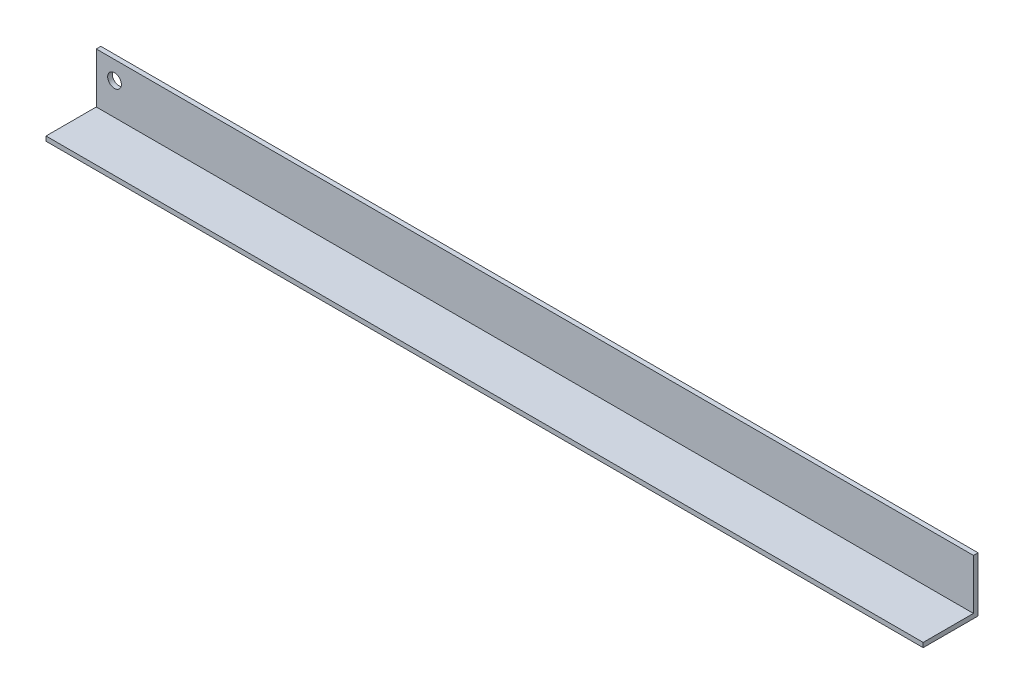
ISO-10303-21;
HEADER;
FILE_DESCRIPTION(('STEP AP214'),'2;1');
FILE_NAME('part.step','',(''),(''),'','','');
FILE_SCHEMA(('AUTOMOTIVE_DESIGN { 1 0 10303 214 1 1 1 1 }'));
ENDSEC;
DATA;
#1=APPLICATION_CONTEXT('core data for automotive mechanical design processes');
#2=APPLICATION_PROTOCOL_DEFINITION('international standard','automotive_design',2000,#1);
#3=PRODUCT_CONTEXT('',#1,'mechanical');
#4=PRODUCT('Part','Part','',(#3));
#5=PRODUCT_RELATED_PRODUCT_CATEGORY('part','',(#4));
#6=PRODUCT_DEFINITION_FORMATION('','',#4);
#7=PRODUCT_DEFINITION_CONTEXT('part definition',#1,'design');
#8=PRODUCT_DEFINITION('design','',#6,#7);
#9=PRODUCT_DEFINITION_SHAPE('','',#8);
#10=(LENGTH_UNIT() NAMED_UNIT(*) SI_UNIT(.MILLI.,.METRE.));
#11=(NAMED_UNIT(*) PLANE_ANGLE_UNIT() SI_UNIT($,.RADIAN.));
#12=(NAMED_UNIT(*) SI_UNIT($,.STERADIAN.) SOLID_ANGLE_UNIT());
#13=UNCERTAINTY_MEASURE_WITH_UNIT(LENGTH_MEASURE(1.E-05),#10,'distance_accuracy_value','');
#14=(GEOMETRIC_REPRESENTATION_CONTEXT(3) GLOBAL_UNCERTAINTY_ASSIGNED_CONTEXT((#13)) GLOBAL_UNIT_ASSIGNED_CONTEXT((#10,
#11,#12)) REPRESENTATION_CONTEXT('',''));
#15=CARTESIAN_POINT('',(0.,0.,0.));
#16=DIRECTION('',(0.,0.,1.));
#17=DIRECTION('',(1.,0.,0.));
#18=AXIS2_PLACEMENT_3D('',#15,#16,#17);
#19=CARTESIAN_POINT('',(304.8,0.,0.));
#20=DIRECTION('',(0.,0.,1.));
#21=DIRECTION('',(1.,0.,0.));
#22=AXIS2_PLACEMENT_3D('',#19,#20,#21);
#23=PLANE('',#22);
#24=CARTESIAN_POINT('',(-292.1,25.4,0.));
#25=DIRECTION('',(0.,0.,-1.));
#26=DIRECTION('',(-1.,0.,0.));
#27=AXIS2_PLACEMENT_3D('',#24,#25,#26);
#28=CIRCLE('',#27,4.76250000000001);
#29=CARTESIAN_POINT('',(-296.8625,25.4,0.));
#30=VERTEX_POINT('',#29);
#31=EDGE_CURVE('E120',#30,#30,#28,.T.);
#32=ORIENTED_EDGE('',*,*,#31,.F.);
#33=EDGE_LOOP('',(#32));
#34=FACE_BOUND('',#33,.T.);
#35=DIRECTION('',(0.,1.,0.));
#36=VECTOR('',#35,1.);
#37=CARTESIAN_POINT('',(-304.8,0.,0.));
#38=LINE('',#37,#36);
#39=CARTESIAN_POINT('',(-304.8,0.,0.));
#40=VERTEX_POINT('',#39);
#41=CARTESIAN_POINT('',(-304.8,38.1,0.));
#42=VERTEX_POINT('',#41);
#43=EDGE_CURVE('E116',#40,#42,#38,.T.);
#44=ORIENTED_EDGE('',*,*,#43,.T.);
#45=DIRECTION('',(-1.,0.,0.));
#46=VECTOR('',#45,1.);
#47=CARTESIAN_POINT('',(304.8,38.1,0.));
#48=LINE('',#47,#46);
#49=CARTESIAN_POINT('',(304.8,38.1,0.));
#50=VERTEX_POINT('',#49);
#51=EDGE_CURVE('E11',#50,#42,#48,.T.);
#52=ORIENTED_EDGE('',*,*,#51,.F.);
#53=DIRECTION('',(0.,1.,0.));
#54=VECTOR('',#53,1.);
#55=CARTESIAN_POINT('',(304.8,0.,0.));
#56=LINE('',#55,#54);
#57=CARTESIAN_POINT('',(304.8,0.,0.));
#58=VERTEX_POINT('',#57);
#59=EDGE_CURVE('E81',#58,#50,#56,.T.);
#60=ORIENTED_EDGE('',*,*,#59,.F.);
#61=DIRECTION('',(-1.,0.,0.));
#62=VECTOR('',#61,1.);
#63=CARTESIAN_POINT('',(304.8,0.,0.));
#64=LINE('',#63,#62);
#65=EDGE_CURVE('E112',#58,#40,#64,.T.);
#66=ORIENTED_EDGE('',*,*,#65,.T.);
#67=EDGE_LOOP('',(#44,#52,#60,#66));
#68=FACE_BOUND('',#67,.T.);
#69=ADVANCED_FACE('F35',(#34,#68),#23,.F.);
#70=CARTESIAN_POINT('',(304.8,38.1,3.175));
#71=DIRECTION('',(0.,1.,0.));
#72=DIRECTION('',(0.,0.,1.));
#73=AXIS2_PLACEMENT_3D('',#70,#71,#72);
#74=PLANE('',#73);
#75=DIRECTION('',(0.,0.,-1.));
#76=VECTOR('',#75,1.);
#77=CARTESIAN_POINT('',(-304.8,38.1,3.175));
#78=LINE('',#77,#76);
#79=CARTESIAN_POINT('',(-304.8,38.1,3.175));
#80=VERTEX_POINT('',#79);
#81=EDGE_CURVE('E119',#80,#42,#78,.T.);
#82=ORIENTED_EDGE('',*,*,#81,.F.);
#83=DIRECTION('',(-1.,0.,0.));
#84=VECTOR('',#83,1.);
#85=CARTESIAN_POINT('',(304.8,38.1,3.175));
#86=LINE('',#85,#84);
#87=CARTESIAN_POINT('',(304.8,38.1,3.175));
#88=VERTEX_POINT('',#87);
#89=EDGE_CURVE('E43',#88,#80,#86,.T.);
#90=ORIENTED_EDGE('',*,*,#89,.F.);
#91=DIRECTION('',(0.,0.,-1.));
#92=VECTOR('',#91,1.);
#93=CARTESIAN_POINT('',(304.8,38.1,3.175));
#94=LINE('',#93,#92);
#95=EDGE_CURVE('E167',#88,#50,#94,.T.);
#96=ORIENTED_EDGE('',*,*,#95,.T.);
#97=ORIENTED_EDGE('',*,*,#51,.T.);
#98=EDGE_LOOP('',(#82,#90,#96,#97));
#99=FACE_BOUND('',#98,.T.);
#100=ADVANCED_FACE('F138',(#99),#74,.T.);
#101=CARTESIAN_POINT('',(304.8,0.,3.175));
#102=DIRECTION('',(0.,0.,1.));
#103=DIRECTION('',(1.,0.,0.));
#104=AXIS2_PLACEMENT_3D('',#101,#102,#103);
#105=PLANE('',#104);
#106=CARTESIAN_POINT('',(-292.1,25.4,3.175));
#107=DIRECTION('',(0.,0.,1.));
#108=DIRECTION('',(1.,0.,0.));
#109=AXIS2_PLACEMENT_3D('',#106,#107,#108);
#110=CIRCLE('',#109,4.76250000000001);
#111=CARTESIAN_POINT('',(-287.3375,25.4,3.175));
#112=VERTEX_POINT('',#111);
#113=EDGE_CURVE('E161',#112,#112,#110,.F.);
#114=ORIENTED_EDGE('',*,*,#113,.T.);
#115=EDGE_LOOP('',(#114));
#116=FACE_BOUND('',#115,.T.);
#117=DIRECTION('',(0.,1.,0.));
#118=VECTOR('',#117,1.);
#119=CARTESIAN_POINT('',(-304.8,0.,3.175));
#120=LINE('',#119,#118);
#121=CARTESIAN_POINT('',(-304.8,3.175,3.175));
#122=VERTEX_POINT('',#121);
#123=EDGE_CURVE('E123',#122,#80,#120,.T.);
#124=ORIENTED_EDGE('',*,*,#123,.F.);
#125=DIRECTION('',(-1.,0.,0.));
#126=VECTOR('',#125,1.);
#127=CARTESIAN_POINT('',(304.8,3.175,3.175));
#128=LINE('',#127,#126);
#129=CARTESIAN_POINT('',(304.8,3.175,3.175));
#130=VERTEX_POINT('',#129);
#131=EDGE_CURVE('E102',#130,#122,#128,.T.);
#132=ORIENTED_EDGE('',*,*,#131,.F.);
#133=DIRECTION('',(0.,1.,0.));
#134=VECTOR('',#133,1.);
#135=CARTESIAN_POINT('',(304.8,0.,3.175));
#136=LINE('',#135,#134);
#137=EDGE_CURVE('E108',#130,#88,#136,.T.);
#138=ORIENTED_EDGE('',*,*,#137,.T.);
#139=ORIENTED_EDGE('',*,*,#89,.T.);
#140=EDGE_LOOP('',(#124,#132,#138,#139));
#141=FACE_BOUND('',#140,.T.);
#142=ADVANCED_FACE('F135',(#116,#141),#105,.T.);
#143=CARTESIAN_POINT('',(304.8,3.175,38.1));
#144=DIRECTION('',(0.,1.,0.));
#145=DIRECTION('',(0.,0.,1.));
#146=AXIS2_PLACEMENT_3D('',#143,#144,#145);
#147=PLANE('',#146);
#148=DIRECTION('',(0.,0.,-1.));
#149=VECTOR('',#148,1.);
#150=CARTESIAN_POINT('',(-304.8,3.175,38.1));
#151=LINE('',#150,#149);
#152=CARTESIAN_POINT('',(-304.8,3.175,38.1));
#153=VERTEX_POINT('',#152);
#154=EDGE_CURVE('E97',#153,#122,#151,.T.);
#155=ORIENTED_EDGE('',*,*,#154,.F.);
#156=DIRECTION('',(-1.,0.,0.));
#157=VECTOR('',#156,1.);
#158=CARTESIAN_POINT('',(304.8,3.175,38.1));
#159=LINE('',#158,#157);
#160=CARTESIAN_POINT('',(304.8,3.175,38.1));
#161=VERTEX_POINT('',#160);
#162=EDGE_CURVE('E92',#161,#153,#159,.T.);
#163=ORIENTED_EDGE('',*,*,#162,.F.);
#164=DIRECTION('',(0.,0.,-1.));
#165=VECTOR('',#164,1.);
#166=CARTESIAN_POINT('',(304.8,3.175,38.1));
#167=LINE('',#166,#165);
#168=EDGE_CURVE('E95',#161,#130,#167,.T.);
#169=ORIENTED_EDGE('',*,*,#168,.T.);
#170=ORIENTED_EDGE('',*,*,#131,.T.);
#171=EDGE_LOOP('',(#155,#163,#169,#170));
#172=FACE_BOUND('',#171,.T.);
#173=ADVANCED_FACE('F94',(#172),#147,.T.);
#174=CARTESIAN_POINT('',(304.8,0.,38.1));
#175=DIRECTION('',(0.,0.,1.));
#176=DIRECTION('',(1.,0.,0.));
#177=AXIS2_PLACEMENT_3D('',#174,#175,#176);
#178=PLANE('',#177);
#179=DIRECTION('',(0.,1.,0.));
#180=VECTOR('',#179,1.);
#181=CARTESIAN_POINT('',(-304.8,0.,38.1));
#182=LINE('',#181,#180);
#183=CARTESIAN_POINT('',(-304.8,0.,38.1));
#184=VERTEX_POINT('',#183);
#185=EDGE_CURVE('E127',#184,#153,#182,.T.);
#186=ORIENTED_EDGE('',*,*,#185,.F.);
#187=DIRECTION('',(-1.,0.,0.));
#188=VECTOR('',#187,1.);
#189=CARTESIAN_POINT('',(304.8,0.,38.1));
#190=LINE('',#189,#188);
#191=CARTESIAN_POINT('',(304.8,0.,38.1));
#192=VERTEX_POINT('',#191);
#193=EDGE_CURVE('E72',#192,#184,#190,.T.);
#194=ORIENTED_EDGE('',*,*,#193,.F.);
#195=DIRECTION('',(0.,1.,0.));
#196=VECTOR('',#195,1.);
#197=CARTESIAN_POINT('',(304.8,0.,38.1));
#198=LINE('',#197,#196);
#199=EDGE_CURVE('E106',#192,#161,#198,.T.);
#200=ORIENTED_EDGE('',*,*,#199,.T.);
#201=ORIENTED_EDGE('',*,*,#162,.T.);
#202=EDGE_LOOP('',(#186,#194,#200,#201));
#203=FACE_BOUND('',#202,.T.);
#204=ADVANCED_FACE('F110',(#203),#178,.T.);
#205=CARTESIAN_POINT('',(304.8,0.,38.1));
#206=DIRECTION('',(0.,1.,0.));
#207=DIRECTION('',(0.,0.,1.));
#208=AXIS2_PLACEMENT_3D('',#205,#206,#207);
#209=PLANE('',#208);
#210=DIRECTION('',(0.,0.,-1.));
#211=VECTOR('',#210,1.);
#212=CARTESIAN_POINT('',(-304.8,0.,38.1));
#213=LINE('',#212,#211);
#214=EDGE_CURVE('E75',#184,#40,#213,.T.);
#215=ORIENTED_EDGE('',*,*,#214,.T.);
#216=ORIENTED_EDGE('',*,*,#65,.F.);
#217=DIRECTION('',(0.,0.,-1.));
#218=VECTOR('',#217,1.);
#219=CARTESIAN_POINT('',(304.8,0.,38.1));
#220=LINE('',#219,#218);
#221=EDGE_CURVE('E51',#192,#58,#220,.T.);
#222=ORIENTED_EDGE('',*,*,#221,.F.);
#223=ORIENTED_EDGE('',*,*,#193,.T.);
#224=EDGE_LOOP('',(#215,#216,#222,#223));
#225=FACE_BOUND('',#224,.T.);
#226=ADVANCED_FACE('F143',(#225),#209,.F.);
#227=CARTESIAN_POINT('',(304.8,0.,0.));
#228=DIRECTION('',(-1.,0.,0.));
#229=DIRECTION('',(0.,0.,1.));
#230=AXIS2_PLACEMENT_3D('',#227,#228,#229);
#231=PLANE('',#230);
#232=ORIENTED_EDGE('',*,*,#59,.T.);
#233=ORIENTED_EDGE('',*,*,#95,.F.);
#234=ORIENTED_EDGE('',*,*,#137,.F.);
#235=ORIENTED_EDGE('',*,*,#168,.F.);
#236=ORIENTED_EDGE('',*,*,#199,.F.);
#237=ORIENTED_EDGE('',*,*,#221,.T.);
#238=EDGE_LOOP('',(#232,#233,#234,#235,#236,#237));
#239=FACE_BOUND('',#238,.T.);
#240=ADVANCED_FACE('F105',(#239),#231,.F.);
#241=CARTESIAN_POINT('',(-304.8,0.,0.));
#242=DIRECTION('',(-1.,0.,0.));
#243=DIRECTION('',(0.,0.,1.));
#244=AXIS2_PLACEMENT_3D('',#241,#242,#243);
#245=PLANE('',#244);
#246=ORIENTED_EDGE('',*,*,#43,.F.);
#247=ORIENTED_EDGE('',*,*,#214,.F.);
#248=ORIENTED_EDGE('',*,*,#185,.T.);
#249=ORIENTED_EDGE('',*,*,#154,.T.);
#250=ORIENTED_EDGE('',*,*,#123,.T.);
#251=ORIENTED_EDGE('',*,*,#81,.T.);
#252=EDGE_LOOP('',(#246,#247,#248,#249,#250,#251));
#253=FACE_BOUND('',#252,.T.);
#254=ADVANCED_FACE('F141',(#253),#245,.T.);
#255=CARTESIAN_POINT('',(-292.1,25.4,38.101));
#256=DIRECTION('',(0.,0.,-1.));
#257=DIRECTION('',(-1.,0.,0.));
#258=AXIS2_PLACEMENT_3D('',#255,#256,#257);
#259=CYLINDRICAL_SURFACE('',#258,4.76250000000001);
#260=ORIENTED_EDGE('',*,*,#113,.F.);
#261=EDGE_LOOP('',(#260));
#262=FACE_BOUND('',#261,.T.);
#263=ORIENTED_EDGE('',*,*,#31,.T.);
#264=EDGE_LOOP('',(#263));
#265=FACE_BOUND('',#264,.T.);
#266=ADVANCED_FACE('F171',(#262,#265),#259,.F.);
#267=CLOSED_SHELL('',(#69,#100,#142,#173,#204,#226,#240,#254,#266));
#268=MANIFOLD_SOLID_BREP('B2',#267);
#269=ADVANCED_BREP_SHAPE_REPRESENTATION('',(#18,#268),#14);
#270=SHAPE_DEFINITION_REPRESENTATION(#9,#269);
ENDSEC;
END-ISO-10303-21;
